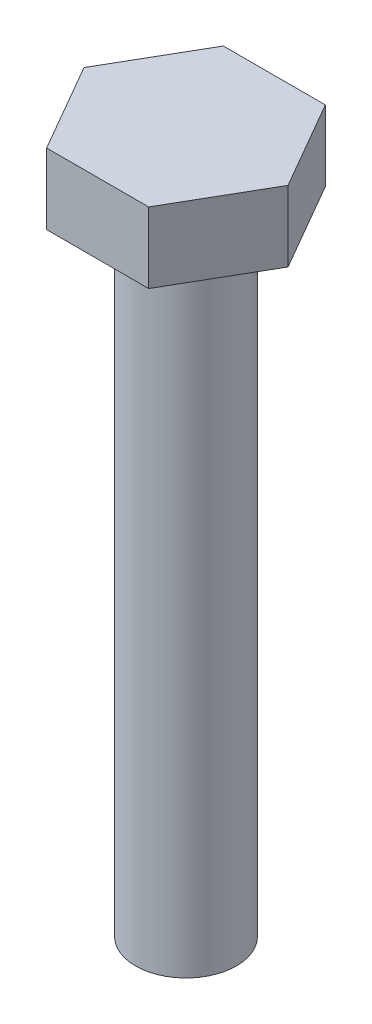
ISO-10303-21;
HEADER;
FILE_DESCRIPTION(('STEP AP214'),'2;1');
FILE_NAME('part.step','',(''),(''),'','','');
FILE_SCHEMA(('AUTOMOTIVE_DESIGN { 1 0 10303 214 1 1 1 1 }'));
ENDSEC;
DATA;
#1=APPLICATION_CONTEXT('core data for automotive mechanical design processes');
#2=APPLICATION_PROTOCOL_DEFINITION('international standard','automotive_design',2000,#1);
#3=PRODUCT_CONTEXT('',#1,'mechanical');
#4=PRODUCT('Part','Part','',(#3));
#5=PRODUCT_RELATED_PRODUCT_CATEGORY('part','',(#4));
#6=PRODUCT_DEFINITION_FORMATION('','',#4);
#7=PRODUCT_DEFINITION_CONTEXT('part definition',#1,'design');
#8=PRODUCT_DEFINITION('design','',#6,#7);
#9=PRODUCT_DEFINITION_SHAPE('','',#8);
#10=(LENGTH_UNIT() NAMED_UNIT(*) SI_UNIT(.MILLI.,.METRE.));
#11=(NAMED_UNIT(*) PLANE_ANGLE_UNIT() SI_UNIT($,.RADIAN.));
#12=(NAMED_UNIT(*) SI_UNIT($,.STERADIAN.) SOLID_ANGLE_UNIT());
#13=UNCERTAINTY_MEASURE_WITH_UNIT(LENGTH_MEASURE(1.E-05),#10,'distance_accuracy_value','');
#14=(GEOMETRIC_REPRESENTATION_CONTEXT(3) GLOBAL_UNCERTAINTY_ASSIGNED_CONTEXT((#13)) GLOBAL_UNIT_ASSIGNED_CONTEXT((#10,
#11,#12)) REPRESENTATION_CONTEXT('',''));
#15=CARTESIAN_POINT('',(0.,0.,0.));
#16=DIRECTION('',(0.,0.,1.));
#17=DIRECTION('',(1.,0.,0.));
#18=AXIS2_PLACEMENT_3D('',#15,#16,#17);
#19=CARTESIAN_POINT('',(0.,25.,0.));
#20=DIRECTION('',(0.,-1.,0.));
#21=DIRECTION('',(0.,0.,-1.));
#22=AXIS2_PLACEMENT_3D('',#19,#20,#21);
#23=CYLINDRICAL_SURFACE('',#22,2.);
#24=CARTESIAN_POINT('',(0.,25.,0.));
#25=DIRECTION('',(0.,1.,0.));
#26=DIRECTION('',(0.,0.,1.));
#27=AXIS2_PLACEMENT_3D('',#24,#25,#26);
#28=CIRCLE('',#27,2.);
#29=CARTESIAN_POINT('',(0.,25.,2.));
#30=VERTEX_POINT('',#29);
#31=EDGE_CURVE('E11',#30,#30,#28,.T.);
#32=ORIENTED_EDGE('',*,*,#31,.F.);
#33=EDGE_LOOP('',(#32));
#34=FACE_BOUND('',#33,.T.);
#35=CARTESIAN_POINT('',(0.,0.,0.));
#36=DIRECTION('',(0.,1.,0.));
#37=DIRECTION('',(0.,0.,1.));
#38=AXIS2_PLACEMENT_3D('',#35,#36,#37);
#39=CIRCLE('',#38,2.);
#40=CARTESIAN_POINT('',(0.,0.,2.));
#41=VERTEX_POINT('',#40);
#42=EDGE_CURVE('E38',#41,#41,#39,.T.);
#43=ORIENTED_EDGE('',*,*,#42,.T.);
#44=EDGE_LOOP('',(#43));
#45=FACE_BOUND('',#44,.T.);
#46=ADVANCED_FACE('F35',(#34,#45),#23,.T.);
#47=CARTESIAN_POINT('',(0.,0.,0.));
#48=DIRECTION('',(0.,1.,0.));
#49=DIRECTION('',(0.,0.,1.));
#50=AXIS2_PLACEMENT_3D('',#47,#48,#49);
#51=PLANE('',#50);
#52=ORIENTED_EDGE('',*,*,#42,.F.);
#53=EDGE_LOOP('',(#52));
#54=FACE_BOUND('',#53,.T.);
#55=ADVANCED_FACE('F143',(#54),#51,.F.);
#56=CARTESIAN_POINT('',(2.02072594216369,27.8,3.5));
#57=DIRECTION('',(-0.866025403784439,0.,-0.5));
#58=DIRECTION('',(-0.5,0.,0.866025403784439));
#59=AXIS2_PLACEMENT_3D('',#56,#57,#58);
#60=PLANE('',#59);
#61=DIRECTION('',(0.5,0.,-0.866025403784439));
#62=VECTOR('',#61,1.);
#63=CARTESIAN_POINT('',(2.02072594216369,25.,3.5));
#64=LINE('',#63,#62);
#65=CARTESIAN_POINT('',(2.02072594216369,25.,3.5));
#66=VERTEX_POINT('',#65);
#67=CARTESIAN_POINT('',(4.04145188432738,25.,0.));
#68=VERTEX_POINT('',#67);
#69=EDGE_CURVE('E120',#66,#68,#64,.T.);
#70=ORIENTED_EDGE('',*,*,#69,.T.);
#71=DIRECTION('',(0.,-1.,0.));
#72=VECTOR('',#71,1.);
#73=CARTESIAN_POINT('',(4.04145188432738,27.8,0.));
#74=LINE('',#73,#72);
#75=CARTESIAN_POINT('',(4.04145188432738,27.8,0.));
#76=VERTEX_POINT('',#75);
#77=EDGE_CURVE('E137',#76,#68,#74,.T.);
#78=ORIENTED_EDGE('',*,*,#77,.F.);
#79=DIRECTION('',(0.5,0.,-0.866025403784439));
#80=VECTOR('',#79,1.);
#81=CARTESIAN_POINT('',(2.02072594216369,27.8,3.5));
#82=LINE('',#81,#80);
#83=CARTESIAN_POINT('',(2.02072594216369,27.8,3.5));
#84=VERTEX_POINT('',#83);
#85=EDGE_CURVE('E130',#84,#76,#82,.T.);
#86=ORIENTED_EDGE('',*,*,#85,.F.);
#87=DIRECTION('',(0.,-1.,0.));
#88=VECTOR('',#87,1.);
#89=CARTESIAN_POINT('',(2.02072594216369,27.8,3.5));
#90=LINE('',#89,#88);
#91=EDGE_CURVE('E116',#84,#66,#90,.T.);
#92=ORIENTED_EDGE('',*,*,#91,.T.);
#93=EDGE_LOOP('',(#70,#78,#86,#92));
#94=FACE_BOUND('',#93,.T.);
#95=ADVANCED_FACE('F145',(#94),#60,.F.);
#96=CARTESIAN_POINT('',(4.04145188432738,27.8,0.));
#97=DIRECTION('',(-0.866025403784438,0.,0.5));
#98=DIRECTION('',(0.5,0.,0.866025403784438));
#99=AXIS2_PLACEMENT_3D('',#96,#97,#98);
#100=PLANE('',#99);
#101=DIRECTION('',(-0.5,0.,-0.866025403784438));
#102=VECTOR('',#101,1.);
#103=CARTESIAN_POINT('',(4.04145188432738,25.,0.));
#104=LINE('',#103,#102);
#105=CARTESIAN_POINT('',(2.02072594216369,25.,-3.5));
#106=VERTEX_POINT('',#105);
#107=EDGE_CURVE('E123',#68,#106,#104,.T.);
#108=ORIENTED_EDGE('',*,*,#107,.T.);
#109=DIRECTION('',(0.,-1.,0.));
#110=VECTOR('',#109,1.);
#111=CARTESIAN_POINT('',(2.02072594216369,27.8,-3.5));
#112=LINE('',#111,#110);
#113=CARTESIAN_POINT('',(2.02072594216369,27.8,-3.5));
#114=VERTEX_POINT('',#113);
#115=EDGE_CURVE('E134',#114,#106,#112,.T.);
#116=ORIENTED_EDGE('',*,*,#115,.F.);
#117=DIRECTION('',(-0.5,0.,-0.866025403784438));
#118=VECTOR('',#117,1.);
#119=CARTESIAN_POINT('',(4.04145188432738,27.8,0.));
#120=LINE('',#119,#118);
#121=EDGE_CURVE('E89',#76,#114,#120,.T.);
#122=ORIENTED_EDGE('',*,*,#121,.F.);
#123=ORIENTED_EDGE('',*,*,#77,.T.);
#124=EDGE_LOOP('',(#108,#116,#122,#123));
#125=FACE_BOUND('',#124,.T.);
#126=ADVANCED_FACE('F150',(#125),#100,.F.);
#127=CARTESIAN_POINT('',(2.02072594216369,27.8,-3.5));
#128=DIRECTION('',(0.,0.,1.));
#129=DIRECTION('',(1.,0.,0.));
#130=AXIS2_PLACEMENT_3D('',#127,#128,#129);
#131=PLANE('',#130);
#132=DIRECTION('',(-1.,0.,0.));
#133=VECTOR('',#132,1.);
#134=CARTESIAN_POINT('',(2.02072594216369,25.,-3.5));
#135=LINE('',#134,#133);
#136=CARTESIAN_POINT('',(-2.02072594216369,25.,-3.5));
#137=VERTEX_POINT('',#136);
#138=EDGE_CURVE('E125',#106,#137,#135,.T.);
#139=ORIENTED_EDGE('',*,*,#138,.T.);
#140=DIRECTION('',(0.,-1.,0.));
#141=VECTOR('',#140,1.);
#142=CARTESIAN_POINT('',(-2.02072594216369,27.8,-3.5));
#143=LINE('',#142,#141);
#144=CARTESIAN_POINT('',(-2.02072594216369,27.8,-3.5));
#145=VERTEX_POINT('',#144);
#146=EDGE_CURVE('E111',#145,#137,#143,.T.);
#147=ORIENTED_EDGE('',*,*,#146,.F.);
#148=DIRECTION('',(-1.,0.,0.));
#149=VECTOR('',#148,1.);
#150=CARTESIAN_POINT('',(2.02072594216369,27.8,-3.5));
#151=LINE('',#150,#149);
#152=EDGE_CURVE('E102',#114,#145,#151,.T.);
#153=ORIENTED_EDGE('',*,*,#152,.F.);
#154=ORIENTED_EDGE('',*,*,#115,.T.);
#155=EDGE_LOOP('',(#139,#147,#153,#154));
#156=FACE_BOUND('',#155,.T.);
#157=ADVANCED_FACE('F157',(#156),#131,.F.);
#158=CARTESIAN_POINT('',(-2.02072594216369,27.8,-3.5));
#159=DIRECTION('',(0.866025403784439,0.,0.5));
#160=DIRECTION('',(0.5,0.,-0.866025403784439));
#161=AXIS2_PLACEMENT_3D('',#158,#159,#160);
#162=PLANE('',#161);
#163=DIRECTION('',(-0.5,0.,0.866025403784439));
#164=VECTOR('',#163,1.);
#165=CARTESIAN_POINT('',(-2.02072594216369,25.,-3.5));
#166=LINE('',#165,#164);
#167=CARTESIAN_POINT('',(-4.04145188432738,25.,0.));
#168=VERTEX_POINT('',#167);
#169=EDGE_CURVE('E110',#137,#168,#166,.T.);
#170=ORIENTED_EDGE('',*,*,#169,.T.);
#171=DIRECTION('',(0.,-1.,0.));
#172=VECTOR('',#171,1.);
#173=CARTESIAN_POINT('',(-4.04145188432738,27.8,0.));
#174=LINE('',#173,#172);
#175=CARTESIAN_POINT('',(-4.04145188432738,27.8,0.));
#176=VERTEX_POINT('',#175);
#177=EDGE_CURVE('E107',#176,#168,#174,.T.);
#178=ORIENTED_EDGE('',*,*,#177,.F.);
#179=DIRECTION('',(-0.5,0.,0.866025403784439));
#180=VECTOR('',#179,1.);
#181=CARTESIAN_POINT('',(-2.02072594216369,27.8,-3.5));
#182=LINE('',#181,#180);
#183=EDGE_CURVE('E96',#145,#176,#182,.T.);
#184=ORIENTED_EDGE('',*,*,#183,.F.);
#185=ORIENTED_EDGE('',*,*,#146,.T.);
#186=EDGE_LOOP('',(#170,#178,#184,#185));
#187=FACE_BOUND('',#186,.T.);
#188=ADVANCED_FACE('F108',(#187),#162,.F.);
#189=CARTESIAN_POINT('',(-4.04145188432738,27.8,0.));
#190=DIRECTION('',(0.866025403784439,0.,-0.5));
#191=DIRECTION('',(-0.5,0.,-0.866025403784439));
#192=AXIS2_PLACEMENT_3D('',#189,#190,#191);
#193=PLANE('',#192);
#194=DIRECTION('',(0.5,0.,0.866025403784439));
#195=VECTOR('',#194,1.);
#196=CARTESIAN_POINT('',(-4.04145188432738,25.,0.));
#197=LINE('',#196,#195);
#198=CARTESIAN_POINT('',(-2.02072594216369,25.,3.5));
#199=VERTEX_POINT('',#198);
#200=EDGE_CURVE('E74',#168,#199,#197,.T.);
#201=ORIENTED_EDGE('',*,*,#200,.T.);
#202=DIRECTION('',(0.,-1.,0.));
#203=VECTOR('',#202,1.);
#204=CARTESIAN_POINT('',(-2.02072594216369,27.8,3.5));
#205=LINE('',#204,#203);
#206=CARTESIAN_POINT('',(-2.02072594216369,27.8,3.5));
#207=VERTEX_POINT('',#206);
#208=EDGE_CURVE('E112',#207,#199,#205,.T.);
#209=ORIENTED_EDGE('',*,*,#208,.F.);
#210=DIRECTION('',(0.5,0.,0.866025403784439));
#211=VECTOR('',#210,1.);
#212=CARTESIAN_POINT('',(-4.04145188432738,27.8,0.));
#213=LINE('',#212,#211);
#214=EDGE_CURVE('E100',#176,#207,#213,.T.);
#215=ORIENTED_EDGE('',*,*,#214,.F.);
#216=ORIENTED_EDGE('',*,*,#177,.T.);
#217=EDGE_LOOP('',(#201,#209,#215,#216));
#218=FACE_BOUND('',#217,.T.);
#219=ADVANCED_FACE('F114',(#218),#193,.F.);
#220=CARTESIAN_POINT('',(-2.02072594216369,27.8,3.5));
#221=DIRECTION('',(0.,0.,-1.));
#222=DIRECTION('',(-1.,0.,0.));
#223=AXIS2_PLACEMENT_3D('',#220,#221,#222);
#224=PLANE('',#223);
#225=DIRECTION('',(1.,0.,0.));
#226=VECTOR('',#225,1.);
#227=CARTESIAN_POINT('',(-2.02072594216369,25.,3.5));
#228=LINE('',#227,#226);
#229=EDGE_CURVE('E80',#199,#66,#228,.T.);
#230=ORIENTED_EDGE('',*,*,#229,.T.);
#231=ORIENTED_EDGE('',*,*,#91,.F.);
#232=DIRECTION('',(1.,0.,0.));
#233=VECTOR('',#232,1.);
#234=CARTESIAN_POINT('',(-2.02072594216369,27.8,3.5));
#235=LINE('',#234,#233);
#236=EDGE_CURVE('E51',#207,#84,#235,.T.);
#237=ORIENTED_EDGE('',*,*,#236,.F.);
#238=ORIENTED_EDGE('',*,*,#208,.T.);
#239=EDGE_LOOP('',(#230,#231,#237,#238));
#240=FACE_BOUND('',#239,.T.);
#241=ADVANCED_FACE('F165',(#240),#224,.F.);
#242=CARTESIAN_POINT('',(0.,27.8,0.));
#243=DIRECTION('',(0.,1.,0.));
#244=DIRECTION('',(0.,0.,1.));
#245=AXIS2_PLACEMENT_3D('',#242,#243,#244);
#246=PLANE('',#245);
#247=ORIENTED_EDGE('',*,*,#85,.T.);
#248=ORIENTED_EDGE('',*,*,#121,.T.);
#249=ORIENTED_EDGE('',*,*,#152,.T.);
#250=ORIENTED_EDGE('',*,*,#183,.T.);
#251=ORIENTED_EDGE('',*,*,#214,.T.);
#252=ORIENTED_EDGE('',*,*,#236,.T.);
#253=EDGE_LOOP('',(#247,#248,#249,#250,#251,#252));
#254=FACE_BOUND('',#253,.T.);
#255=ADVANCED_FACE('F98',(#254),#246,.T.);
#256=CARTESIAN_POINT('',(0.,25.,0.));
#257=DIRECTION('',(0.,1.,0.));
#258=DIRECTION('',(0.,0.,1.));
#259=AXIS2_PLACEMENT_3D('',#256,#257,#258);
#260=PLANE('',#259);
#261=ORIENTED_EDGE('',*,*,#31,.T.);
#262=EDGE_LOOP('',(#261));
#263=FACE_BOUND('',#262,.T.);
#264=ORIENTED_EDGE('',*,*,#69,.F.);
#265=ORIENTED_EDGE('',*,*,#229,.F.);
#266=ORIENTED_EDGE('',*,*,#200,.F.);
#267=ORIENTED_EDGE('',*,*,#169,.F.);
#268=ORIENTED_EDGE('',*,*,#138,.F.);
#269=ORIENTED_EDGE('',*,*,#107,.F.);
#270=EDGE_LOOP('',(#264,#265,#266,#267,#268,#269));
#271=FACE_BOUND('',#270,.T.);
#272=ADVANCED_FACE('F168',(#263,#271),#260,.F.);
#273=CLOSED_SHELL('',(#46,#55,#95,#126,#157,#188,#219,#241,#255,#272));
#274=MANIFOLD_SOLID_BREP('B2',#273);
#275=ADVANCED_BREP_SHAPE_REPRESENTATION('',(#18,#274),#14);
#276=SHAPE_DEFINITION_REPRESENTATION(#9,#275);
ENDSEC;
END-ISO-10303-21;
